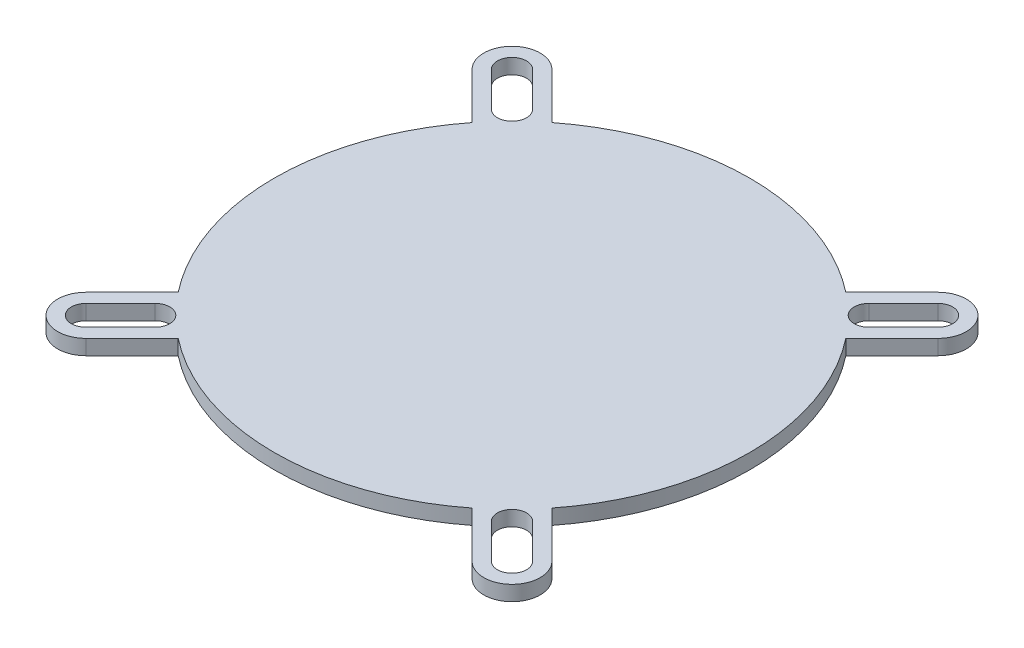
ISO-10303-21;
HEADER;
FILE_DESCRIPTION(('STEP AP214'),'2;1');
FILE_NAME('part.step','',(''),(''),'','','');
FILE_SCHEMA(('AUTOMOTIVE_DESIGN { 1 0 10303 214 1 1 1 1 }'));
ENDSEC;
DATA;
#1=APPLICATION_CONTEXT('core data for automotive mechanical design processes');
#2=APPLICATION_PROTOCOL_DEFINITION('international standard','automotive_design',2000,#1);
#3=PRODUCT_CONTEXT('',#1,'mechanical');
#4=PRODUCT('Part','Part','',(#3));
#5=PRODUCT_RELATED_PRODUCT_CATEGORY('part','',(#4));
#6=PRODUCT_DEFINITION_FORMATION('','',#4);
#7=PRODUCT_DEFINITION_CONTEXT('part definition',#1,'design');
#8=PRODUCT_DEFINITION('design','',#6,#7);
#9=PRODUCT_DEFINITION_SHAPE('','',#8);
#10=(LENGTH_UNIT() NAMED_UNIT(*) SI_UNIT(.MILLI.,.METRE.));
#11=(NAMED_UNIT(*) PLANE_ANGLE_UNIT() SI_UNIT($,.RADIAN.));
#12=(NAMED_UNIT(*) SI_UNIT($,.STERADIAN.) SOLID_ANGLE_UNIT());
#13=UNCERTAINTY_MEASURE_WITH_UNIT(LENGTH_MEASURE(1.E-05),#10,'distance_accuracy_value','');
#14=(GEOMETRIC_REPRESENTATION_CONTEXT(3) GLOBAL_UNCERTAINTY_ASSIGNED_CONTEXT((#13)) GLOBAL_UNIT_ASSIGNED_CONTEXT((#10,
#11,#12)) REPRESENTATION_CONTEXT('',''));
#15=CARTESIAN_POINT('',(0.,0.,0.));
#16=DIRECTION('',(0.,0.,1.));
#17=DIRECTION('',(1.,0.,0.));
#18=AXIS2_PLACEMENT_3D('',#15,#16,#17);
#19=CARTESIAN_POINT('',(0.,1.6,0.));
#20=DIRECTION('',(0.,-1.,0.));
#21=DIRECTION('',(0.,0.,-1.));
#22=AXIS2_PLACEMENT_3D('',#19,#20,#21);
#23=CYLINDRICAL_SURFACE('',#22,25.25);
#24=CARTESIAN_POINT('',(0.,0.,0.));
#25=DIRECTION('',(0.,1.,0.));
#26=DIRECTION('',(0.,0.,1.));
#27=AXIS2_PLACEMENT_3D('',#24,#25,#26);
#28=CIRCLE('',#27,25.25);
#29=CARTESIAN_POINT('',(-19.8492996418328,0.,-15.6066589547134));
#30=VERTEX_POINT('',#29);
#31=CARTESIAN_POINT('',(-19.8492996418328,0.,15.6066589547135));
#32=VERTEX_POINT('',#31);
#33=EDGE_CURVE('E491',#30,#32,#28,.T.);
#34=ORIENTED_EDGE('',*,*,#33,.T.);
#35=DIRECTION('',(0.,-1.,0.));
#36=VECTOR('',#35,1.);
#37=CARTESIAN_POINT('',(-19.8492996418328,1.6,15.6066589547135));
#38=LINE('',#37,#36);
#39=CARTESIAN_POINT('',(-19.8492996418328,1.6,15.6066589547135));
#40=VERTEX_POINT('',#39);
#41=EDGE_CURVE('E463',#32,#40,#38,.F.);
#42=ORIENTED_EDGE('',*,*,#41,.T.);
#43=CARTESIAN_POINT('',(0.,1.6,0.));
#44=DIRECTION('',(0.,1.,0.));
#45=DIRECTION('',(0.,0.,1.));
#46=AXIS2_PLACEMENT_3D('',#43,#44,#45);
#47=CIRCLE('',#46,25.25);
#48=CARTESIAN_POINT('',(-19.8492996418328,1.6,-15.6066589547134));
#49=VERTEX_POINT('',#48);
#50=EDGE_CURVE('E483',#49,#40,#47,.T.);
#51=ORIENTED_EDGE('',*,*,#50,.F.);
#52=DIRECTION('',(0.,-1.,0.));
#53=VECTOR('',#52,1.);
#54=CARTESIAN_POINT('',(-19.8492996418328,1.6,-15.6066589547134));
#55=LINE('',#54,#53);
#56=EDGE_CURVE('E444',#49,#30,#55,.T.);
#57=ORIENTED_EDGE('',*,*,#56,.T.);
#58=EDGE_LOOP('',(#34,#42,#51,#57));
#59=FACE_BOUND('',#58,.T.);
#60=ADVANCED_FACE('F35',(#59),#23,.T.);
#61=CARTESIAN_POINT('',(15.6066589547135,0.,-19.8492996418328));
#62=VERTEX_POINT('',#61);
#63=CARTESIAN_POINT('',(-15.6066589547135,0.,-19.8492996418327));
#64=VERTEX_POINT('',#63);
#65=EDGE_CURVE('E487',#62,#64,#28,.T.);
#66=ORIENTED_EDGE('',*,*,#65,.T.);
#67=DIRECTION('',(0.,-1.,0.));
#68=VECTOR('',#67,1.);
#69=CARTESIAN_POINT('',(-15.6066589547135,1.6,-19.8492996418327));
#70=LINE('',#69,#68);
#71=CARTESIAN_POINT('',(-15.6066589547135,1.6,-19.8492996418327));
#72=VERTEX_POINT('',#71);
#73=EDGE_CURVE('E481',#64,#72,#70,.F.);
#74=ORIENTED_EDGE('',*,*,#73,.T.);
#75=CARTESIAN_POINT('',(15.6066589547135,1.6,-19.8492996418328));
#76=VERTEX_POINT('',#75);
#77=EDGE_CURVE('E44',#76,#72,#47,.T.);
#78=ORIENTED_EDGE('',*,*,#77,.F.);
#79=DIRECTION('',(0.,-1.,0.));
#80=VECTOR('',#79,1.);
#81=CARTESIAN_POINT('',(15.6066589547135,1.6,-19.8492996418328));
#82=LINE('',#81,#80);
#83=EDGE_CURVE('E478',#76,#62,#82,.T.);
#84=ORIENTED_EDGE('',*,*,#83,.T.);
#85=EDGE_LOOP('',(#66,#74,#78,#84));
#86=FACE_BOUND('',#85,.T.);
#87=ADVANCED_FACE('F527',(#86),#23,.T.);
#88=CARTESIAN_POINT('',(19.8492996418327,0.,15.6066589547135));
#89=VERTEX_POINT('',#88);
#90=CARTESIAN_POINT('',(19.8492996418327,0.,-15.6066589547135));
#91=VERTEX_POINT('',#90);
#92=EDGE_CURVE('E484',#89,#91,#28,.T.);
#93=ORIENTED_EDGE('',*,*,#92,.T.);
#94=DIRECTION('',(0.,-1.,0.));
#95=VECTOR('',#94,1.);
#96=CARTESIAN_POINT('',(19.8492996418327,1.6,-15.6066589547135));
#97=LINE('',#96,#95);
#98=CARTESIAN_POINT('',(19.8492996418327,1.6,-15.6066589547135));
#99=VERTEX_POINT('',#98);
#100=EDGE_CURVE('E475',#91,#99,#97,.F.);
#101=ORIENTED_EDGE('',*,*,#100,.T.);
#102=CARTESIAN_POINT('',(19.8492996418327,1.6,15.6066589547135));
#103=VERTEX_POINT('',#102);
#104=EDGE_CURVE('E11',#103,#99,#47,.T.);
#105=ORIENTED_EDGE('',*,*,#104,.F.);
#106=DIRECTION('',(0.,-1.,0.));
#107=VECTOR('',#106,1.);
#108=CARTESIAN_POINT('',(19.8492996418327,1.6,15.6066589547135));
#109=LINE('',#108,#107);
#110=EDGE_CURVE('E472',#103,#89,#109,.T.);
#111=ORIENTED_EDGE('',*,*,#110,.T.);
#112=EDGE_LOOP('',(#93,#101,#105,#111));
#113=FACE_BOUND('',#112,.T.);
#114=ADVANCED_FACE('F523',(#113),#23,.T.);
#115=CARTESIAN_POINT('',(-15.6066589547135,0.,19.8492996418328));
#116=VERTEX_POINT('',#115);
#117=CARTESIAN_POINT('',(15.6066589547134,0.,19.8492996418328));
#118=VERTEX_POINT('',#117);
#119=EDGE_CURVE('E39',#116,#118,#28,.T.);
#120=ORIENTED_EDGE('',*,*,#119,.T.);
#121=DIRECTION('',(0.,-1.,0.));
#122=VECTOR('',#121,1.);
#123=CARTESIAN_POINT('',(15.6066589547134,1.6,19.8492996418328));
#124=LINE('',#123,#122);
#125=CARTESIAN_POINT('',(15.6066589547134,1.6,19.8492996418328));
#126=VERTEX_POINT('',#125);
#127=EDGE_CURVE('E469',#118,#126,#124,.F.);
#128=ORIENTED_EDGE('',*,*,#127,.T.);
#129=CARTESIAN_POINT('',(-15.6066589547135,1.6,19.8492996418328));
#130=VERTEX_POINT('',#129);
#131=EDGE_CURVE('E45',#130,#126,#47,.T.);
#132=ORIENTED_EDGE('',*,*,#131,.F.);
#133=DIRECTION('',(0.,-1.,0.));
#134=VECTOR('',#133,1.);
#135=CARTESIAN_POINT('',(-15.6066589547135,1.6,19.8492996418328));
#136=LINE('',#135,#134);
#137=EDGE_CURVE('E466',#130,#116,#136,.T.);
#138=ORIENTED_EDGE('',*,*,#137,.T.);
#139=EDGE_LOOP('',(#120,#128,#132,#138));
#140=FACE_BOUND('',#139,.T.);
#141=ADVANCED_FACE('F37',(#140),#23,.T.);
#142=CARTESIAN_POINT('',(0.,1.6,0.));
#143=DIRECTION('',(0.,1.,0.));
#144=DIRECTION('',(0.,0.,1.));
#145=AXIS2_PLACEMENT_3D('',#142,#143,#144);
#146=PLANE('',#145);
#147=CARTESIAN_POINT('',(18.9504617358008,1.6,18.9504617357982));
#148=DIRECTION('',(0.,1.,0.));
#149=DIRECTION('',(0.,0.,1.));
#150=AXIS2_PLACEMENT_3D('',#147,#148,#149);
#151=CIRCLE('',#150,1.55);
#152=CARTESIAN_POINT('',(20.0464772466399,1.6,17.854446224959));
#153=VERTEX_POINT('',#152);
#154=CARTESIAN_POINT('',(17.8544462249616,1.6,20.0464772466373));
#155=VERTEX_POINT('',#154);
#156=EDGE_CURVE('E310',#153,#155,#151,.T.);
#157=ORIENTED_EDGE('',*,*,#156,.F.);
#158=DIRECTION('',(-0.707106781186548,0.,-0.707106781186547));
#159=VECTOR('',#158,1.);
#160=CARTESIAN_POINT('',(23.72343250881,1.6,21.5314014871291));
#161=LINE('',#160,#159);
#162=CARTESIAN_POINT('',(23.72343250881,1.6,21.5314014871291));
#163=VERTEX_POINT('',#162);
#164=EDGE_CURVE('E307',#163,#153,#161,.T.);
#165=ORIENTED_EDGE('',*,*,#164,.F.);
#166=CARTESIAN_POINT('',(22.6274169979708,1.6,22.6274169979682));
#167=DIRECTION('',(0.,1.,0.));
#168=DIRECTION('',(0.,0.,1.));
#169=AXIS2_PLACEMENT_3D('',#166,#167,#168);
#170=CIRCLE('',#169,1.55);
#171=CARTESIAN_POINT('',(21.5314014871317,1.6,23.7234325088074));
#172=VERTEX_POINT('',#171);
#173=EDGE_CURVE('E288',#172,#163,#170,.T.);
#174=ORIENTED_EDGE('',*,*,#173,.F.);
#175=DIRECTION('',(0.707106781186547,0.,0.707106781186548));
#176=VECTOR('',#175,1.);
#177=CARTESIAN_POINT('',(21.5314014871317,1.6,23.7234325088074));
#178=LINE('',#177,#176);
#179=EDGE_CURVE('E297',#155,#172,#178,.T.);
#180=ORIENTED_EDGE('',*,*,#179,.F.);
#181=EDGE_LOOP('',(#157,#165,#174,#180));
#182=FACE_BOUND('',#181,.T.);
#183=CARTESIAN_POINT('',(18.9504617357994,1.6,-18.9504617358008));
#184=DIRECTION('',(0.,1.,0.));
#185=DIRECTION('',(0.,0.,1.));
#186=AXIS2_PLACEMENT_3D('',#183,#184,#185);
#187=CIRCLE('',#186,1.55);
#188=CARTESIAN_POINT('',(17.8544462249603,1.6,-20.0464772466399));
#189=VERTEX_POINT('',#188);
#190=CARTESIAN_POINT('',(20.0464772466386,1.6,-17.8544462249616));
#191=VERTEX_POINT('',#190);
#192=EDGE_CURVE('E342',#189,#191,#187,.T.);
#193=ORIENTED_EDGE('',*,*,#192,.F.);
#194=DIRECTION('',(-0.707106781186547,0.,0.707106781186547));
#195=VECTOR('',#194,1.);
#196=CARTESIAN_POINT('',(21.5314014871303,1.6,-23.72343250881));
#197=LINE('',#196,#195);
#198=CARTESIAN_POINT('',(21.5314014871303,1.6,-23.72343250881));
#199=VERTEX_POINT('',#198);
#200=EDGE_CURVE('E339',#199,#189,#197,.T.);
#201=ORIENTED_EDGE('',*,*,#200,.F.);
#202=CARTESIAN_POINT('',(22.6274169979695,1.6,-22.6274169979708));
#203=DIRECTION('',(0.,1.,0.));
#204=DIRECTION('',(0.,0.,1.));
#205=AXIS2_PLACEMENT_3D('',#202,#203,#204);
#206=CIRCLE('',#205,1.55);
#207=CARTESIAN_POINT('',(23.7234325088086,1.6,-21.5314014871317));
#208=VERTEX_POINT('',#207);
#209=EDGE_CURVE('E316',#208,#199,#206,.T.);
#210=ORIENTED_EDGE('',*,*,#209,.F.);
#211=DIRECTION('',(0.707106781186547,0.,-0.707106781186548));
#212=VECTOR('',#211,1.);
#213=CARTESIAN_POINT('',(23.7234325088086,1.6,-21.5314014871317));
#214=LINE('',#213,#212);
#215=EDGE_CURVE('E329',#191,#208,#214,.T.);
#216=ORIENTED_EDGE('',*,*,#215,.F.);
#217=EDGE_LOOP('',(#193,#201,#210,#216));
#218=FACE_BOUND('',#217,.T.);
#219=CARTESIAN_POINT('',(-18.9504617357995,1.6,-18.9504617357994));
#220=DIRECTION('',(0.,1.,0.));
#221=DIRECTION('',(0.,0.,1.));
#222=AXIS2_PLACEMENT_3D('',#219,#220,#221);
#223=CIRCLE('',#222,1.55);
#224=CARTESIAN_POINT('',(-20.0464772466387,1.6,-17.8544462249603));
#225=VERTEX_POINT('',#224);
#226=CARTESIAN_POINT('',(-17.8544462249604,1.6,-20.0464772466386));
#227=VERTEX_POINT('',#226);
#228=EDGE_CURVE('E374',#225,#227,#223,.T.);
#229=ORIENTED_EDGE('',*,*,#228,.F.);
#230=DIRECTION('',(0.707106781186547,0.,0.707106781186547));
#231=VECTOR('',#230,1.);
#232=CARTESIAN_POINT('',(-23.7234325088087,1.6,-21.5314014871303));
#233=LINE('',#232,#231);
#234=CARTESIAN_POINT('',(-23.7234325088087,1.6,-21.5314014871303));
#235=VERTEX_POINT('',#234);
#236=EDGE_CURVE('E371',#235,#225,#233,.T.);
#237=ORIENTED_EDGE('',*,*,#236,.F.);
#238=CARTESIAN_POINT('',(-22.6274169979696,1.6,-22.6274169979695));
#239=DIRECTION('',(0.,1.,0.));
#240=DIRECTION('',(0.,0.,1.));
#241=AXIS2_PLACEMENT_3D('',#238,#239,#240);
#242=CIRCLE('',#241,1.55);
#243=CARTESIAN_POINT('',(-21.5314014871304,1.6,-23.7234325088086));
#244=VERTEX_POINT('',#243);
#245=EDGE_CURVE('E348',#244,#235,#242,.T.);
#246=ORIENTED_EDGE('',*,*,#245,.F.);
#247=DIRECTION('',(-0.707106781186547,0.,-0.707106781186547));
#248=VECTOR('',#247,1.);
#249=CARTESIAN_POINT('',(-21.5314014871304,1.6,-23.7234325088086));
#250=LINE('',#249,#248);
#251=EDGE_CURVE('E361',#227,#244,#250,.T.);
#252=ORIENTED_EDGE('',*,*,#251,.F.);
#253=EDGE_LOOP('',(#229,#237,#246,#252));
#254=FACE_BOUND('',#253,.T.);
#255=CARTESIAN_POINT('',(-18.9504617357982,1.6,18.9504617357995));
#256=DIRECTION('',(0.,1.,0.));
#257=DIRECTION('',(0.,0.,1.));
#258=AXIS2_PLACEMENT_3D('',#255,#256,#257);
#259=CIRCLE('',#258,1.55);
#260=CARTESIAN_POINT('',(-17.854446224959,1.6,20.0464772466387));
#261=VERTEX_POINT('',#260);
#262=CARTESIAN_POINT('',(-20.0464772466373,1.6,17.8544462249604));
#263=VERTEX_POINT('',#262);
#264=EDGE_CURVE('E277',#261,#263,#259,.T.);
#265=ORIENTED_EDGE('',*,*,#264,.F.);
#266=DIRECTION('',(0.707106781186547,0.,-0.707106781186548));
#267=VECTOR('',#266,1.);
#268=CARTESIAN_POINT('',(-21.5314014871291,1.6,23.7234325088087));
#269=LINE('',#268,#267);
#270=CARTESIAN_POINT('',(-21.5314014871291,1.6,23.7234325088087));
#271=VERTEX_POINT('',#270);
#272=EDGE_CURVE('E283',#271,#261,#269,.T.);
#273=ORIENTED_EDGE('',*,*,#272,.F.);
#274=CARTESIAN_POINT('',(-22.6274169979682,1.6,22.6274169979696));
#275=DIRECTION('',(0.,1.,0.));
#276=DIRECTION('',(0.,0.,1.));
#277=AXIS2_PLACEMENT_3D('',#274,#275,#276);
#278=CIRCLE('',#277,1.55);
#279=CARTESIAN_POINT('',(-23.7234325088074,1.6,21.5314014871304));
#280=VERTEX_POINT('',#279);
#281=EDGE_CURVE('E256',#280,#271,#278,.T.);
#282=ORIENTED_EDGE('',*,*,#281,.F.);
#283=DIRECTION('',(-0.707106781186547,0.,0.707106781186548));
#284=VECTOR('',#283,1.);
#285=CARTESIAN_POINT('',(-23.7234325088074,1.6,21.5314014871304));
#286=LINE('',#285,#284);
#287=EDGE_CURVE('E274',#263,#280,#286,.T.);
#288=ORIENTED_EDGE('',*,*,#287,.F.);
#289=EDGE_LOOP('',(#265,#273,#282,#288));
#290=FACE_BOUND('',#289,.T.);
#291=ORIENTED_EDGE('',*,*,#77,.T.);
#292=DIRECTION('',(-0.707106781186548,0.,-0.707106781186547));
#293=VECTOR('',#292,1.);
#294=CARTESIAN_POINT('',(-20.5060966544099,1.6,-24.7487373415291));
#295=LINE('',#294,#293);
#296=CARTESIAN_POINT('',(-20.5060966544099,1.6,-24.7487373415291));
#297=VERTEX_POINT('',#296);
#298=EDGE_CURVE('E393',#72,#297,#295,.T.);
#299=ORIENTED_EDGE('',*,*,#298,.T.);
#300=CARTESIAN_POINT('',(-22.6274169979696,1.6,-22.6274169979695));
#301=DIRECTION('',(0.,1.,0.));
#302=DIRECTION('',(0.,0.,1.));
#303=AXIS2_PLACEMENT_3D('',#300,#301,#302);
#304=CIRCLE('',#303,3.);
#305=CARTESIAN_POINT('',(-24.7487373415292,1.6,-20.5060966544098));
#306=VERTEX_POINT('',#305);
#307=EDGE_CURVE('E380',#297,#306,#304,.T.);
#308=ORIENTED_EDGE('',*,*,#307,.T.);
#309=DIRECTION('',(0.707106781186548,0.,0.707106781186547));
#310=VECTOR('',#309,1.);
#311=CARTESIAN_POINT('',(-24.7487373415292,1.6,-20.5060966544098));
#312=LINE('',#311,#310);
#313=EDGE_CURVE('E59',#306,#49,#312,.T.);
#314=ORIENTED_EDGE('',*,*,#313,.T.);
#315=ORIENTED_EDGE('',*,*,#50,.T.);
#316=DIRECTION('',(-0.707106781186547,0.,0.707106781186548));
#317=VECTOR('',#316,1.);
#318=CARTESIAN_POINT('',(-24.7487373415292,1.6,20.5060966544099));
#319=LINE('',#318,#317);
#320=CARTESIAN_POINT('',(-24.7487373415292,1.6,20.5060966544099));
#321=VERTEX_POINT('',#320);
#322=EDGE_CURVE('E421',#40,#321,#319,.T.);
#323=ORIENTED_EDGE('',*,*,#322,.T.);
#324=CARTESIAN_POINT('',(-22.6274169979695,1.6,22.6274169979695));
#325=DIRECTION('',(0.,1.,0.));
#326=DIRECTION('',(0.,0.,1.));
#327=AXIS2_PLACEMENT_3D('',#324,#325,#326);
#328=CIRCLE('',#327,3.);
#329=CARTESIAN_POINT('',(-20.5060966544099,1.6,24.7487373415292));
#330=VERTEX_POINT('',#329);
#331=EDGE_CURVE('E423',#321,#330,#328,.T.);
#332=ORIENTED_EDGE('',*,*,#331,.T.);
#333=DIRECTION('',(0.707106781186547,0.,-0.707106781186548));
#334=VECTOR('',#333,1.);
#335=CARTESIAN_POINT('',(-20.5060966544099,1.6,24.7487373415292));
#336=LINE('',#335,#334);
#337=EDGE_CURVE('E52',#330,#130,#336,.T.);
#338=ORIENTED_EDGE('',*,*,#337,.T.);
#339=ORIENTED_EDGE('',*,*,#131,.T.);
#340=DIRECTION('',(0.707106781186547,0.,0.707106781186548));
#341=VECTOR('',#340,1.);
#342=CARTESIAN_POINT('',(0.,1.6,4.24264068711931));
#343=LINE('',#342,#341);
#344=CARTESIAN_POINT('',(20.5060966544098,1.6,24.7487373415292));
#345=VERTEX_POINT('',#344);
#346=EDGE_CURVE('E426',#126,#345,#343,.T.);
#347=ORIENTED_EDGE('',*,*,#346,.T.);
#348=CARTESIAN_POINT('',(22.6274169979695,1.6,22.6274169979696));
#349=DIRECTION('',(0.,1.,0.));
#350=DIRECTION('',(0.,0.,1.));
#351=AXIS2_PLACEMENT_3D('',#348,#349,#350);
#352=CIRCLE('',#351,3.);
#353=CARTESIAN_POINT('',(24.7487373415291,1.6,20.5060966544099));
#354=VERTEX_POINT('',#353);
#355=EDGE_CURVE('E428',#345,#354,#352,.T.);
#356=ORIENTED_EDGE('',*,*,#355,.T.);
#357=DIRECTION('',(-0.707106781186548,0.,-0.707106781186547));
#358=VECTOR('',#357,1.);
#359=CARTESIAN_POINT('',(4.24264068711924,1.6,0.));
#360=LINE('',#359,#358);
#361=EDGE_CURVE('E431',#354,#103,#360,.T.);
#362=ORIENTED_EDGE('',*,*,#361,.T.);
#363=ORIENTED_EDGE('',*,*,#104,.T.);
#364=DIRECTION('',(0.707106781186547,0.,-0.707106781186548));
#365=VECTOR('',#364,1.);
#366=CARTESIAN_POINT('',(4.24264068711924,1.6,0.));
#367=LINE('',#366,#365);
#368=CARTESIAN_POINT('',(24.7487373415292,1.6,-20.5060966544099));
#369=VERTEX_POINT('',#368);
#370=EDGE_CURVE('E433',#99,#369,#367,.T.);
#371=ORIENTED_EDGE('',*,*,#370,.T.);
#372=CARTESIAN_POINT('',(22.6274169979695,1.6,-22.6274169979695));
#373=DIRECTION('',(0.,1.,0.));
#374=DIRECTION('',(0.,0.,1.));
#375=AXIS2_PLACEMENT_3D('',#372,#373,#374);
#376=CIRCLE('',#375,3.);
#377=CARTESIAN_POINT('',(20.5060966544099,1.6,-24.7487373415292));
#378=VERTEX_POINT('',#377);
#379=EDGE_CURVE('E435',#369,#378,#376,.T.);
#380=ORIENTED_EDGE('',*,*,#379,.T.);
#381=DIRECTION('',(-0.707106781186547,0.,0.707106781186548));
#382=VECTOR('',#381,1.);
#383=CARTESIAN_POINT('',(0.,1.6,-4.24264068711925));
#384=LINE('',#383,#382);
#385=EDGE_CURVE('E438',#378,#76,#384,.T.);
#386=ORIENTED_EDGE('',*,*,#385,.T.);
#387=EDGE_LOOP('',(#291,#299,#308,#314,#315,#323,#332,#338,#339,#347,#356,#362,#363,#371,#380,#386));
#388=FACE_BOUND('',#387,.T.);
#389=ADVANCED_FACE('F512',(#182,#218,#254,#290,#388),#146,.T.);
#390=CARTESIAN_POINT('',(0.,0.,0.));
#391=DIRECTION('',(0.,1.,0.));
#392=DIRECTION('',(0.,0.,1.));
#393=AXIS2_PLACEMENT_3D('',#390,#391,#392);
#394=PLANE('',#393);
#395=DIRECTION('',(-0.707106781186548,0.,-0.707106781186547));
#396=VECTOR('',#395,1.);
#397=CARTESIAN_POINT('',(23.72343250881,0.,21.5314014871291));
#398=LINE('',#397,#396);
#399=CARTESIAN_POINT('',(23.72343250881,0.,21.5314014871291));
#400=VERTEX_POINT('',#399);
#401=CARTESIAN_POINT('',(20.0464772466399,0.,17.854446224959));
#402=VERTEX_POINT('',#401);
#403=EDGE_CURVE('E296',#400,#402,#398,.T.);
#404=ORIENTED_EDGE('',*,*,#403,.T.);
#405=CARTESIAN_POINT('',(18.9504617358008,0.,18.9504617357982));
#406=DIRECTION('',(0.,1.,0.));
#407=DIRECTION('',(0.,0.,1.));
#408=AXIS2_PLACEMENT_3D('',#405,#406,#407);
#409=CIRCLE('',#408,1.55);
#410=CARTESIAN_POINT('',(17.8544462249616,0.,20.0464772466373));
#411=VERTEX_POINT('',#410);
#412=EDGE_CURVE('E300',#402,#411,#409,.T.);
#413=ORIENTED_EDGE('',*,*,#412,.T.);
#414=DIRECTION('',(0.707106781186547,0.,0.707106781186548));
#415=VECTOR('',#414,1.);
#416=CARTESIAN_POINT('',(21.5314014871317,0.,23.7234325088074));
#417=LINE('',#416,#415);
#418=CARTESIAN_POINT('',(21.5314014871317,0.,23.7234325088074));
#419=VERTEX_POINT('',#418);
#420=EDGE_CURVE('E302',#411,#419,#417,.T.);
#421=ORIENTED_EDGE('',*,*,#420,.T.);
#422=CARTESIAN_POINT('',(22.6274169979708,0.,22.6274169979682));
#423=DIRECTION('',(0.,1.,0.));
#424=DIRECTION('',(0.,0.,1.));
#425=AXIS2_PLACEMENT_3D('',#422,#423,#424);
#426=CIRCLE('',#425,1.55);
#427=EDGE_CURVE('E293',#419,#400,#426,.T.);
#428=ORIENTED_EDGE('',*,*,#427,.T.);
#429=EDGE_LOOP('',(#404,#413,#421,#428));
#430=FACE_BOUND('',#429,.T.);
#431=DIRECTION('',(-0.707106781186547,0.,0.707106781186547));
#432=VECTOR('',#431,1.);
#433=CARTESIAN_POINT('',(21.5314014871303,0.,-23.72343250881));
#434=LINE('',#433,#432);
#435=CARTESIAN_POINT('',(21.5314014871303,0.,-23.72343250881));
#436=VERTEX_POINT('',#435);
#437=CARTESIAN_POINT('',(17.8544462249603,0.,-20.0464772466399));
#438=VERTEX_POINT('',#437);
#439=EDGE_CURVE('E328',#436,#438,#434,.T.);
#440=ORIENTED_EDGE('',*,*,#439,.T.);
#441=CARTESIAN_POINT('',(18.9504617357994,0.,-18.9504617358008));
#442=DIRECTION('',(0.,1.,0.));
#443=DIRECTION('',(0.,0.,1.));
#444=AXIS2_PLACEMENT_3D('',#441,#442,#443);
#445=CIRCLE('',#444,1.55);
#446=CARTESIAN_POINT('',(20.0464772466386,0.,-17.8544462249616));
#447=VERTEX_POINT('',#446);
#448=EDGE_CURVE('E332',#438,#447,#445,.T.);
#449=ORIENTED_EDGE('',*,*,#448,.T.);
#450=DIRECTION('',(0.707106781186547,0.,-0.707106781186548));
#451=VECTOR('',#450,1.);
#452=CARTESIAN_POINT('',(23.7234325088086,0.,-21.5314014871317));
#453=LINE('',#452,#451);
#454=CARTESIAN_POINT('',(23.7234325088086,0.,-21.5314014871317));
#455=VERTEX_POINT('',#454);
#456=EDGE_CURVE('E334',#447,#455,#453,.T.);
#457=ORIENTED_EDGE('',*,*,#456,.T.);
#458=CARTESIAN_POINT('',(22.6274169979695,0.,-22.6274169979708));
#459=DIRECTION('',(0.,1.,0.));
#460=DIRECTION('',(0.,0.,1.));
#461=AXIS2_PLACEMENT_3D('',#458,#459,#460);
#462=CIRCLE('',#461,1.55);
#463=EDGE_CURVE('E325',#455,#436,#462,.T.);
#464=ORIENTED_EDGE('',*,*,#463,.T.);
#465=EDGE_LOOP('',(#440,#449,#457,#464));
#466=FACE_BOUND('',#465,.T.);
#467=DIRECTION('',(0.707106781186547,0.,0.707106781186547));
#468=VECTOR('',#467,1.);
#469=CARTESIAN_POINT('',(-23.7234325088087,0.,-21.5314014871303));
#470=LINE('',#469,#468);
#471=CARTESIAN_POINT('',(-23.7234325088087,0.,-21.5314014871303));
#472=VERTEX_POINT('',#471);
#473=CARTESIAN_POINT('',(-20.0464772466387,0.,-17.8544462249603));
#474=VERTEX_POINT('',#473);
#475=EDGE_CURVE('E360',#472,#474,#470,.T.);
#476=ORIENTED_EDGE('',*,*,#475,.T.);
#477=CARTESIAN_POINT('',(-18.9504617357995,0.,-18.9504617357994));
#478=DIRECTION('',(0.,1.,0.));
#479=DIRECTION('',(0.,0.,1.));
#480=AXIS2_PLACEMENT_3D('',#477,#478,#479);
#481=CIRCLE('',#480,1.55);
#482=CARTESIAN_POINT('',(-17.8544462249604,0.,-20.0464772466386));
#483=VERTEX_POINT('',#482);
#484=EDGE_CURVE('E364',#474,#483,#481,.T.);
#485=ORIENTED_EDGE('',*,*,#484,.T.);
#486=DIRECTION('',(-0.707106781186547,0.,-0.707106781186547));
#487=VECTOR('',#486,1.);
#488=CARTESIAN_POINT('',(-21.5314014871304,0.,-23.7234325088086));
#489=LINE('',#488,#487);
#490=CARTESIAN_POINT('',(-21.5314014871304,0.,-23.7234325088086));
#491=VERTEX_POINT('',#490);
#492=EDGE_CURVE('E366',#483,#491,#489,.T.);
#493=ORIENTED_EDGE('',*,*,#492,.T.);
#494=CARTESIAN_POINT('',(-22.6274169979696,0.,-22.6274169979695));
#495=DIRECTION('',(0.,1.,0.));
#496=DIRECTION('',(0.,0.,1.));
#497=AXIS2_PLACEMENT_3D('',#494,#495,#496);
#498=CIRCLE('',#497,1.55);
#499=EDGE_CURVE('E357',#491,#472,#498,.T.);
#500=ORIENTED_EDGE('',*,*,#499,.T.);
#501=EDGE_LOOP('',(#476,#485,#493,#500));
#502=FACE_BOUND('',#501,.T.);
#503=DIRECTION('',(0.707106781186547,0.,-0.707106781186548));
#504=VECTOR('',#503,1.);
#505=CARTESIAN_POINT('',(-21.5314014871291,0.,23.7234325088087));
#506=LINE('',#505,#504);
#507=CARTESIAN_POINT('',(-21.5314014871291,0.,23.7234325088087));
#508=VERTEX_POINT('',#507);
#509=CARTESIAN_POINT('',(-17.854446224959,0.,20.0464772466387));
#510=VERTEX_POINT('',#509);
#511=EDGE_CURVE('E265',#508,#510,#506,.T.);
#512=ORIENTED_EDGE('',*,*,#511,.T.);
#513=CARTESIAN_POINT('',(-18.9504617357982,0.,18.9504617357995));
#514=DIRECTION('',(0.,1.,0.));
#515=DIRECTION('',(0.,0.,1.));
#516=AXIS2_PLACEMENT_3D('',#513,#514,#515);
#517=CIRCLE('',#516,1.55);
#518=CARTESIAN_POINT('',(-20.0464772466373,0.,17.8544462249604));
#519=VERTEX_POINT('',#518);
#520=EDGE_CURVE('E269',#510,#519,#517,.T.);
#521=ORIENTED_EDGE('',*,*,#520,.T.);
#522=DIRECTION('',(-0.707106781186547,0.,0.707106781186548));
#523=VECTOR('',#522,1.);
#524=CARTESIAN_POINT('',(-23.7234325088074,0.,21.5314014871304));
#525=LINE('',#524,#523);
#526=CARTESIAN_POINT('',(-23.7234325088074,0.,21.5314014871304));
#527=VERTEX_POINT('',#526);
#528=EDGE_CURVE('E261',#519,#527,#525,.T.);
#529=ORIENTED_EDGE('',*,*,#528,.T.);
#530=CARTESIAN_POINT('',(-22.6274169979682,0.,22.6274169979696));
#531=DIRECTION('',(0.,1.,0.));
#532=DIRECTION('',(0.,0.,1.));
#533=AXIS2_PLACEMENT_3D('',#530,#531,#532);
#534=CIRCLE('',#533,1.55);
#535=EDGE_CURVE('E253',#527,#508,#534,.T.);
#536=ORIENTED_EDGE('',*,*,#535,.T.);
#537=EDGE_LOOP('',(#512,#521,#529,#536));
#538=FACE_BOUND('',#537,.T.);
#539=DIRECTION('',(-0.707106781186548,0.,-0.707106781186547));
#540=VECTOR('',#539,1.);
#541=CARTESIAN_POINT('',(-20.5060966544099,0.,-24.7487373415291));
#542=LINE('',#541,#540);
#543=CARTESIAN_POINT('',(-20.5060966544099,0.,-24.7487373415291));
#544=VERTEX_POINT('',#543);
#545=EDGE_CURVE('E416',#64,#544,#542,.T.);
#546=ORIENTED_EDGE('',*,*,#545,.F.);
#547=ORIENTED_EDGE('',*,*,#65,.F.);
#548=DIRECTION('',(-0.707106781186547,0.,0.707106781186548));
#549=VECTOR('',#548,1.);
#550=CARTESIAN_POINT('',(0.,0.,-4.24264068711925));
#551=LINE('',#550,#549);
#552=CARTESIAN_POINT('',(20.5060966544099,0.,-24.7487373415292));
#553=VERTEX_POINT('',#552);
#554=EDGE_CURVE('E414',#553,#62,#551,.T.);
#555=ORIENTED_EDGE('',*,*,#554,.F.);
#556=CARTESIAN_POINT('',(22.6274169979695,0.,-22.6274169979695));
#557=DIRECTION('',(0.,1.,0.));
#558=DIRECTION('',(0.,0.,1.));
#559=AXIS2_PLACEMENT_3D('',#556,#557,#558);
#560=CIRCLE('',#559,3.);
#561=CARTESIAN_POINT('',(24.7487373415292,0.,-20.5060966544099));
#562=VERTEX_POINT('',#561);
#563=EDGE_CURVE('E411',#562,#553,#560,.T.);
#564=ORIENTED_EDGE('',*,*,#563,.F.);
#565=DIRECTION('',(0.707106781186547,0.,-0.707106781186548));
#566=VECTOR('',#565,1.);
#567=CARTESIAN_POINT('',(4.24264068711924,0.,0.));
#568=LINE('',#567,#566);
#569=EDGE_CURVE('E409',#91,#562,#568,.T.);
#570=ORIENTED_EDGE('',*,*,#569,.F.);
#571=ORIENTED_EDGE('',*,*,#92,.F.);
#572=DIRECTION('',(-0.707106781186548,0.,-0.707106781186547));
#573=VECTOR('',#572,1.);
#574=CARTESIAN_POINT('',(4.24264068711924,0.,0.));
#575=LINE('',#574,#573);
#576=CARTESIAN_POINT('',(24.7487373415291,0.,20.5060966544099));
#577=VERTEX_POINT('',#576);
#578=EDGE_CURVE('E407',#577,#89,#575,.T.);
#579=ORIENTED_EDGE('',*,*,#578,.F.);
#580=CARTESIAN_POINT('',(22.6274169979695,0.,22.6274169979696));
#581=DIRECTION('',(0.,1.,0.));
#582=DIRECTION('',(0.,0.,1.));
#583=AXIS2_PLACEMENT_3D('',#580,#581,#582);
#584=CIRCLE('',#583,3.);
#585=CARTESIAN_POINT('',(20.5060966544098,0.,24.7487373415292));
#586=VERTEX_POINT('',#585);
#587=EDGE_CURVE('E404',#586,#577,#584,.T.);
#588=ORIENTED_EDGE('',*,*,#587,.F.);
#589=DIRECTION('',(0.707106781186547,0.,0.707106781186548));
#590=VECTOR('',#589,1.);
#591=CARTESIAN_POINT('',(0.,0.,4.24264068711931));
#592=LINE('',#591,#590);
#593=EDGE_CURVE('E402',#118,#586,#592,.T.);
#594=ORIENTED_EDGE('',*,*,#593,.F.);
#595=ORIENTED_EDGE('',*,*,#119,.F.);
#596=DIRECTION('',(0.707106781186547,0.,-0.707106781186548));
#597=VECTOR('',#596,1.);
#598=CARTESIAN_POINT('',(-20.5060966544099,0.,24.7487373415292));
#599=LINE('',#598,#597);
#600=CARTESIAN_POINT('',(-20.5060966544099,0.,24.7487373415292));
#601=VERTEX_POINT('',#600);
#602=EDGE_CURVE('E400',#601,#116,#599,.T.);
#603=ORIENTED_EDGE('',*,*,#602,.F.);
#604=CARTESIAN_POINT('',(-22.6274169979695,0.,22.6274169979695));
#605=DIRECTION('',(0.,1.,0.));
#606=DIRECTION('',(0.,0.,1.));
#607=AXIS2_PLACEMENT_3D('',#604,#605,#606);
#608=CIRCLE('',#607,3.);
#609=CARTESIAN_POINT('',(-24.7487373415292,0.,20.5060966544099));
#610=VERTEX_POINT('',#609);
#611=EDGE_CURVE('E397',#610,#601,#608,.T.);
#612=ORIENTED_EDGE('',*,*,#611,.F.);
#613=DIRECTION('',(-0.707106781186547,0.,0.707106781186548));
#614=VECTOR('',#613,1.);
#615=CARTESIAN_POINT('',(-24.7487373415292,0.,20.5060966544099));
#616=LINE('',#615,#614);
#617=EDGE_CURVE('E395',#32,#610,#616,.T.);
#618=ORIENTED_EDGE('',*,*,#617,.F.);
#619=ORIENTED_EDGE('',*,*,#33,.F.);
#620=DIRECTION('',(0.707106781186548,0.,0.707106781186547));
#621=VECTOR('',#620,1.);
#622=CARTESIAN_POINT('',(-24.7487373415292,0.,-20.5060966544098));
#623=LINE('',#622,#621);
#624=CARTESIAN_POINT('',(-24.7487373415292,0.,-20.5060966544098));
#625=VERTEX_POINT('',#624);
#626=EDGE_CURVE('E392',#625,#30,#623,.T.);
#627=ORIENTED_EDGE('',*,*,#626,.F.);
#628=CARTESIAN_POINT('',(-22.6274169979696,0.,-22.6274169979695));
#629=DIRECTION('',(0.,1.,0.));
#630=DIRECTION('',(0.,0.,1.));
#631=AXIS2_PLACEMENT_3D('',#628,#629,#630);
#632=CIRCLE('',#631,3.);
#633=EDGE_CURVE('E389',#544,#625,#632,.T.);
#634=ORIENTED_EDGE('',*,*,#633,.F.);
#635=EDGE_LOOP('',(#546,#547,#555,#564,#570,#571,#579,#588,#594,#595,#603,#612,#618,#619,#627,#634));
#636=FACE_BOUND('',#635,.T.);
#637=ADVANCED_FACE('F271',(#430,#466,#502,#538,#636),#394,.F.);
#638=CARTESIAN_POINT('',(-18.9504617357982,0.,18.9504617357995));
#639=DIRECTION('',(0.,1.,0.));
#640=DIRECTION('',(0.,0.,1.));
#641=AXIS2_PLACEMENT_3D('',#638,#639,#640);
#642=CYLINDRICAL_SURFACE('',#641,1.55);
#643=ORIENTED_EDGE('',*,*,#520,.F.);
#644=DIRECTION('',(0.,1.,0.));
#645=VECTOR('',#644,1.);
#646=CARTESIAN_POINT('',(-17.854446224959,0.,20.0464772466387));
#647=LINE('',#646,#645);
#648=EDGE_CURVE('E260',#510,#261,#647,.T.);
#649=ORIENTED_EDGE('',*,*,#648,.T.);
#650=ORIENTED_EDGE('',*,*,#264,.T.);
#651=DIRECTION('',(0.,1.,0.));
#652=VECTOR('',#651,1.);
#653=CARTESIAN_POINT('',(-20.0464772466373,0.,17.8544462249604));
#654=LINE('',#653,#652);
#655=EDGE_CURVE('E289',#519,#263,#654,.T.);
#656=ORIENTED_EDGE('',*,*,#655,.F.);
#657=EDGE_LOOP('',(#643,#649,#650,#656));
#658=FACE_BOUND('',#657,.T.);
#659=ADVANCED_FACE('F521',(#658),#642,.F.);
#660=CARTESIAN_POINT('',(-23.7234325088074,0.,21.5314014871304));
#661=DIRECTION('',(-0.707106781186548,0.,-0.707106781186547));
#662=DIRECTION('',(-0.707106781186547,0.,0.707106781186548));
#663=AXIS2_PLACEMENT_3D('',#660,#661,#662);
#664=PLANE('',#663);
#665=ORIENTED_EDGE('',*,*,#287,.T.);
#666=DIRECTION('',(0.,1.,0.));
#667=VECTOR('',#666,1.);
#668=CARTESIAN_POINT('',(-23.7234325088074,0.,21.5314014871304));
#669=LINE('',#668,#667);
#670=EDGE_CURVE('E286',#527,#280,#669,.T.);
#671=ORIENTED_EDGE('',*,*,#670,.F.);
#672=ORIENTED_EDGE('',*,*,#528,.F.);
#673=ORIENTED_EDGE('',*,*,#655,.T.);
#674=EDGE_LOOP('',(#665,#671,#672,#673));
#675=FACE_BOUND('',#674,.T.);
#676=ADVANCED_FACE('F637',(#675),#664,.F.);
#677=CARTESIAN_POINT('',(-22.6274169979682,0.,22.6274169979696));
#678=DIRECTION('',(0.,1.,0.));
#679=DIRECTION('',(0.,0.,1.));
#680=AXIS2_PLACEMENT_3D('',#677,#678,#679);
#681=CYLINDRICAL_SURFACE('',#680,1.55);
#682=ORIENTED_EDGE('',*,*,#281,.T.);
#683=DIRECTION('',(0.,1.,0.));
#684=VECTOR('',#683,1.);
#685=CARTESIAN_POINT('',(-21.5314014871291,0.,23.7234325088087));
#686=LINE('',#685,#684);
#687=EDGE_CURVE('E249',#508,#271,#686,.T.);
#688=ORIENTED_EDGE('',*,*,#687,.F.);
#689=ORIENTED_EDGE('',*,*,#535,.F.);
#690=ORIENTED_EDGE('',*,*,#670,.T.);
#691=EDGE_LOOP('',(#682,#688,#689,#690));
#692=FACE_BOUND('',#691,.T.);
#693=ADVANCED_FACE('F251',(#692),#681,.F.);
#694=CARTESIAN_POINT('',(-21.5314014871291,0.,23.7234325088087));
#695=DIRECTION('',(0.707106781186548,0.,0.707106781186547));
#696=DIRECTION('',(0.707106781186547,0.,-0.707106781186548));
#697=AXIS2_PLACEMENT_3D('',#694,#695,#696);
#698=PLANE('',#697);
#699=ORIENTED_EDGE('',*,*,#272,.T.);
#700=ORIENTED_EDGE('',*,*,#648,.F.);
#701=ORIENTED_EDGE('',*,*,#511,.F.);
#702=ORIENTED_EDGE('',*,*,#687,.T.);
#703=EDGE_LOOP('',(#699,#700,#701,#702));
#704=FACE_BOUND('',#703,.T.);
#705=ADVANCED_FACE('F266',(#704),#698,.F.);
#706=CARTESIAN_POINT('',(-22.6274169979695,0.,22.6274169979695));
#707=DIRECTION('',(0.,1.,0.));
#708=DIRECTION('',(0.,0.,1.));
#709=AXIS2_PLACEMENT_3D('',#706,#707,#708);
#710=CYLINDRICAL_SURFACE('',#709,3.);
#711=ORIENTED_EDGE('',*,*,#331,.F.);
#712=DIRECTION('',(0.,1.,0.));
#713=VECTOR('',#712,1.);
#714=CARTESIAN_POINT('',(-24.7487373415292,0.,20.5060966544099));
#715=LINE('',#714,#713);
#716=EDGE_CURVE('E457',#610,#321,#715,.T.);
#717=ORIENTED_EDGE('',*,*,#716,.F.);
#718=ORIENTED_EDGE('',*,*,#611,.T.);
#719=DIRECTION('',(0.,1.,0.));
#720=VECTOR('',#719,1.);
#721=CARTESIAN_POINT('',(-20.5060966544099,0.,24.7487373415292));
#722=LINE('',#721,#720);
#723=EDGE_CURVE('E455',#601,#330,#722,.T.);
#724=ORIENTED_EDGE('',*,*,#723,.T.);
#725=EDGE_LOOP('',(#711,#717,#718,#724));
#726=FACE_BOUND('',#725,.T.);
#727=ADVANCED_FACE('F510',(#726),#710,.T.);
#728=CARTESIAN_POINT('',(-24.7487373415292,0.,20.5060966544099));
#729=DIRECTION('',(-0.707106781186548,0.,-0.707106781186548));
#730=DIRECTION('',(-0.707106781186547,0.,0.707106781186548));
#731=AXIS2_PLACEMENT_3D('',#728,#729,#730);
#732=PLANE('',#731);
#733=ORIENTED_EDGE('',*,*,#41,.F.);
#734=ORIENTED_EDGE('',*,*,#617,.T.);
#735=ORIENTED_EDGE('',*,*,#716,.T.);
#736=ORIENTED_EDGE('',*,*,#322,.F.);
#737=EDGE_LOOP('',(#733,#734,#735,#736));
#738=FACE_BOUND('',#737,.T.);
#739=ADVANCED_FACE('F507',(#738),#732,.T.);
#740=CARTESIAN_POINT('',(-20.5060966544099,0.,24.7487373415292));
#741=DIRECTION('',(0.707106781186548,0.,0.707106781186547));
#742=DIRECTION('',(0.707106781186547,0.,-0.707106781186548));
#743=AXIS2_PLACEMENT_3D('',#740,#741,#742);
#744=PLANE('',#743);
#745=ORIENTED_EDGE('',*,*,#137,.F.);
#746=ORIENTED_EDGE('',*,*,#337,.F.);
#747=ORIENTED_EDGE('',*,*,#723,.F.);
#748=ORIENTED_EDGE('',*,*,#602,.T.);
#749=EDGE_LOOP('',(#745,#746,#747,#748));
#750=FACE_BOUND('',#749,.T.);
#751=ADVANCED_FACE('F559',(#750),#744,.T.);
#752=CARTESIAN_POINT('',(-18.9504617357995,0.,-18.9504617357994));
#753=DIRECTION('',(0.,1.,0.));
#754=DIRECTION('',(0.,0.,1.));
#755=AXIS2_PLACEMENT_3D('',#752,#753,#754);
#756=CYLINDRICAL_SURFACE('',#755,1.55);
#757=ORIENTED_EDGE('',*,*,#484,.F.);
#758=DIRECTION('',(0.,1.,0.));
#759=VECTOR('',#758,1.);
#760=CARTESIAN_POINT('',(-20.0464772466387,0.,-17.8544462249603));
#761=LINE('',#760,#759);
#762=EDGE_CURVE('E384',#474,#225,#761,.T.);
#763=ORIENTED_EDGE('',*,*,#762,.T.);
#764=ORIENTED_EDGE('',*,*,#228,.T.);
#765=DIRECTION('',(0.,1.,0.));
#766=VECTOR('',#765,1.);
#767=CARTESIAN_POINT('',(-17.8544462249604,0.,-20.0464772466386));
#768=LINE('',#767,#766);
#769=EDGE_CURVE('E381',#483,#227,#768,.T.);
#770=ORIENTED_EDGE('',*,*,#769,.F.);
#771=EDGE_LOOP('',(#757,#763,#764,#770));
#772=FACE_BOUND('',#771,.T.);
#773=ADVANCED_FACE('F564',(#772),#756,.F.);
#774=CARTESIAN_POINT('',(-21.5314014871304,0.,-23.7234325088086));
#775=DIRECTION('',(0.707106781186548,0.,-0.707106781186548));
#776=DIRECTION('',(-0.707106781186548,0.,-0.707106781186548));
#777=AXIS2_PLACEMENT_3D('',#774,#775,#776);
#778=PLANE('',#777);
#779=ORIENTED_EDGE('',*,*,#251,.T.);
#780=DIRECTION('',(0.,1.,0.));
#781=VECTOR('',#780,1.);
#782=CARTESIAN_POINT('',(-21.5314014871304,0.,-23.7234325088086));
#783=LINE('',#782,#781);
#784=EDGE_CURVE('E378',#491,#244,#783,.T.);
#785=ORIENTED_EDGE('',*,*,#784,.F.);
#786=ORIENTED_EDGE('',*,*,#492,.F.);
#787=ORIENTED_EDGE('',*,*,#769,.T.);
#788=EDGE_LOOP('',(#779,#785,#786,#787));
#789=FACE_BOUND('',#788,.T.);
#790=ADVANCED_FACE('F596',(#789),#778,.F.);
#791=CARTESIAN_POINT('',(-22.6274169979696,0.,-22.6274169979695));
#792=DIRECTION('',(0.,1.,0.));
#793=DIRECTION('',(0.,0.,1.));
#794=AXIS2_PLACEMENT_3D('',#791,#792,#793);
#795=CYLINDRICAL_SURFACE('',#794,1.55);
#796=ORIENTED_EDGE('',*,*,#245,.T.);
#797=DIRECTION('',(0.,1.,0.));
#798=VECTOR('',#797,1.);
#799=CARTESIAN_POINT('',(-23.7234325088087,0.,-21.5314014871303));
#800=LINE('',#799,#798);
#801=EDGE_CURVE('E369',#472,#235,#800,.T.);
#802=ORIENTED_EDGE('',*,*,#801,.F.);
#803=ORIENTED_EDGE('',*,*,#499,.F.);
#804=ORIENTED_EDGE('',*,*,#784,.T.);
#805=EDGE_LOOP('',(#796,#802,#803,#804));
#806=FACE_BOUND('',#805,.T.);
#807=ADVANCED_FACE('F593',(#806),#795,.F.);
#808=CARTESIAN_POINT('',(-23.7234325088087,0.,-21.5314014871303));
#809=DIRECTION('',(-0.707106781186548,0.,0.707106781186548));
#810=DIRECTION('',(0.707106781186548,0.,0.707106781186548));
#811=AXIS2_PLACEMENT_3D('',#808,#809,#810);
#812=PLANE('',#811);
#813=ORIENTED_EDGE('',*,*,#236,.T.);
#814=ORIENTED_EDGE('',*,*,#762,.F.);
#815=ORIENTED_EDGE('',*,*,#475,.F.);
#816=ORIENTED_EDGE('',*,*,#801,.T.);
#817=EDGE_LOOP('',(#813,#814,#815,#816));
#818=FACE_BOUND('',#817,.T.);
#819=ADVANCED_FACE('F555',(#818),#812,.F.);
#820=CARTESIAN_POINT('',(-22.6274169979696,0.,-22.6274169979695));
#821=DIRECTION('',(0.,1.,0.));
#822=DIRECTION('',(0.,0.,1.));
#823=AXIS2_PLACEMENT_3D('',#820,#821,#822);
#824=CYLINDRICAL_SURFACE('',#823,3.);
#825=ORIENTED_EDGE('',*,*,#307,.F.);
#826=DIRECTION('',(0.,1.,0.));
#827=VECTOR('',#826,1.);
#828=CARTESIAN_POINT('',(-20.5060966544099,0.,-24.7487373415291));
#829=LINE('',#828,#827);
#830=EDGE_CURVE('E441',#544,#297,#829,.T.);
#831=ORIENTED_EDGE('',*,*,#830,.F.);
#832=ORIENTED_EDGE('',*,*,#633,.T.);
#833=DIRECTION('',(0.,1.,0.));
#834=VECTOR('',#833,1.);
#835=CARTESIAN_POINT('',(-24.7487373415292,0.,-20.5060966544098));
#836=LINE('',#835,#834);
#837=EDGE_CURVE('E418',#625,#306,#836,.T.);
#838=ORIENTED_EDGE('',*,*,#837,.T.);
#839=EDGE_LOOP('',(#825,#831,#832,#838));
#840=FACE_BOUND('',#839,.T.);
#841=ADVANCED_FACE('F544',(#840),#824,.T.);
#842=CARTESIAN_POINT('',(-24.7487373415292,0.,-20.5060966544098));
#843=DIRECTION('',(-0.707106781186547,0.,0.707106781186548));
#844=DIRECTION('',(0.707106781186548,0.,0.707106781186547));
#845=AXIS2_PLACEMENT_3D('',#842,#843,#844);
#846=PLANE('',#845);
#847=ORIENTED_EDGE('',*,*,#56,.F.);
#848=ORIENTED_EDGE('',*,*,#313,.F.);
#849=ORIENTED_EDGE('',*,*,#837,.F.);
#850=ORIENTED_EDGE('',*,*,#626,.T.);
#851=EDGE_LOOP('',(#847,#848,#849,#850));
#852=FACE_BOUND('',#851,.T.);
#853=ADVANCED_FACE('F546',(#852),#846,.T.);
#854=CARTESIAN_POINT('',(-20.5060966544099,0.,-24.7487373415291));
#855=DIRECTION('',(0.707106781186548,0.,-0.707106781186548));
#856=DIRECTION('',(-0.707106781186548,0.,-0.707106781186548));
#857=AXIS2_PLACEMENT_3D('',#854,#855,#856);
#858=PLANE('',#857);
#859=ORIENTED_EDGE('',*,*,#73,.F.);
#860=ORIENTED_EDGE('',*,*,#545,.T.);
#861=ORIENTED_EDGE('',*,*,#830,.T.);
#862=ORIENTED_EDGE('',*,*,#298,.F.);
#863=EDGE_LOOP('',(#859,#860,#861,#862));
#864=FACE_BOUND('',#863,.T.);
#865=ADVANCED_FACE('F541',(#864),#858,.T.);
#866=CARTESIAN_POINT('',(18.9504617357994,0.,-18.9504617358008));
#867=DIRECTION('',(0.,1.,0.));
#868=DIRECTION('',(0.,0.,1.));
#869=AXIS2_PLACEMENT_3D('',#866,#867,#868);
#870=CYLINDRICAL_SURFACE('',#869,1.55);
#871=ORIENTED_EDGE('',*,*,#448,.F.);
#872=DIRECTION('',(0.,1.,0.));
#873=VECTOR('',#872,1.);
#874=CARTESIAN_POINT('',(17.8544462249603,0.,-20.0464772466399));
#875=LINE('',#874,#873);
#876=EDGE_CURVE('E352',#438,#189,#875,.T.);
#877=ORIENTED_EDGE('',*,*,#876,.T.);
#878=ORIENTED_EDGE('',*,*,#192,.T.);
#879=DIRECTION('',(0.,1.,0.));
#880=VECTOR('',#879,1.);
#881=CARTESIAN_POINT('',(20.0464772466386,0.,-17.8544462249616));
#882=LINE('',#881,#880);
#883=EDGE_CURVE('E349',#447,#191,#882,.T.);
#884=ORIENTED_EDGE('',*,*,#883,.F.);
#885=EDGE_LOOP('',(#871,#877,#878,#884));
#886=FACE_BOUND('',#885,.T.);
#887=ADVANCED_FACE('F553',(#886),#870,.F.);
#888=CARTESIAN_POINT('',(23.7234325088086,0.,-21.5314014871317));
#889=DIRECTION('',(0.707106781186548,0.,0.707106781186547));
#890=DIRECTION('',(0.707106781186547,0.,-0.707106781186548));
#891=AXIS2_PLACEMENT_3D('',#888,#889,#890);
#892=PLANE('',#891);
#893=ORIENTED_EDGE('',*,*,#215,.T.);
#894=DIRECTION('',(0.,1.,0.));
#895=VECTOR('',#894,1.);
#896=CARTESIAN_POINT('',(23.7234325088086,0.,-21.5314014871317));
#897=LINE('',#896,#895);
#898=EDGE_CURVE('E346',#455,#208,#897,.T.);
#899=ORIENTED_EDGE('',*,*,#898,.F.);
#900=ORIENTED_EDGE('',*,*,#456,.F.);
#901=ORIENTED_EDGE('',*,*,#883,.T.);
#902=EDGE_LOOP('',(#893,#899,#900,#901));
#903=FACE_BOUND('',#902,.T.);
#904=ADVANCED_FACE('F610',(#903),#892,.F.);
#905=CARTESIAN_POINT('',(22.6274169979695,0.,-22.6274169979708));
#906=DIRECTION('',(0.,1.,0.));
#907=DIRECTION('',(0.,0.,1.));
#908=AXIS2_PLACEMENT_3D('',#905,#906,#907);
#909=CYLINDRICAL_SURFACE('',#908,1.55);
#910=ORIENTED_EDGE('',*,*,#209,.T.);
#911=DIRECTION('',(0.,1.,0.));
#912=VECTOR('',#911,1.);
#913=CARTESIAN_POINT('',(21.5314014871303,0.,-23.72343250881));
#914=LINE('',#913,#912);
#915=EDGE_CURVE('E337',#436,#199,#914,.T.);
#916=ORIENTED_EDGE('',*,*,#915,.F.);
#917=ORIENTED_EDGE('',*,*,#463,.F.);
#918=ORIENTED_EDGE('',*,*,#898,.T.);
#919=EDGE_LOOP('',(#910,#916,#917,#918));
#920=FACE_BOUND('',#919,.T.);
#921=ADVANCED_FACE('F607',(#920),#909,.F.);
#922=CARTESIAN_POINT('',(21.5314014871303,0.,-23.72343250881));
#923=DIRECTION('',(-0.707106781186548,0.,-0.707106781186548));
#924=DIRECTION('',(-0.707106781186548,0.,0.707106781186548));
#925=AXIS2_PLACEMENT_3D('',#922,#923,#924);
#926=PLANE('',#925);
#927=ORIENTED_EDGE('',*,*,#200,.T.);
#928=ORIENTED_EDGE('',*,*,#876,.F.);
#929=ORIENTED_EDGE('',*,*,#439,.F.);
#930=ORIENTED_EDGE('',*,*,#915,.T.);
#931=EDGE_LOOP('',(#927,#928,#929,#930));
#932=FACE_BOUND('',#931,.T.);
#933=ADVANCED_FACE('F588',(#932),#926,.F.);
#934=CARTESIAN_POINT('',(22.6274169979695,0.,-22.6274169979695));
#935=DIRECTION('',(0.,1.,0.));
#936=DIRECTION('',(0.,0.,1.));
#937=AXIS2_PLACEMENT_3D('',#934,#935,#936);
#938=CYLINDRICAL_SURFACE('',#937,3.);
#939=ORIENTED_EDGE('',*,*,#379,.F.);
#940=DIRECTION('',(0.,1.,0.));
#941=VECTOR('',#940,1.);
#942=CARTESIAN_POINT('',(24.7487373415292,0.,-20.5060966544099));
#943=LINE('',#942,#941);
#944=EDGE_CURVE('E447',#562,#369,#943,.T.);
#945=ORIENTED_EDGE('',*,*,#944,.F.);
#946=ORIENTED_EDGE('',*,*,#563,.T.);
#947=DIRECTION('',(0.,1.,0.));
#948=VECTOR('',#947,1.);
#949=CARTESIAN_POINT('',(20.5060966544099,0.,-24.7487373415292));
#950=LINE('',#949,#948);
#951=EDGE_CURVE('E445',#553,#378,#950,.T.);
#952=ORIENTED_EDGE('',*,*,#951,.T.);
#953=EDGE_LOOP('',(#939,#945,#946,#952));
#954=FACE_BOUND('',#953,.T.);
#955=ADVANCED_FACE('F584',(#954),#938,.T.);
#956=CARTESIAN_POINT('',(4.24264068711924,0.,0.));
#957=DIRECTION('',(0.707106781186548,0.,0.707106781186547));
#958=DIRECTION('',(0.707106781186547,0.,-0.707106781186548));
#959=AXIS2_PLACEMENT_3D('',#956,#957,#958);
#960=PLANE('',#959);
#961=ORIENTED_EDGE('',*,*,#100,.F.);
#962=ORIENTED_EDGE('',*,*,#569,.T.);
#963=ORIENTED_EDGE('',*,*,#944,.T.);
#964=ORIENTED_EDGE('',*,*,#370,.F.);
#965=EDGE_LOOP('',(#961,#962,#963,#964));
#966=FACE_BOUND('',#965,.T.);
#967=ADVANCED_FACE('F581',(#966),#960,.T.);
#968=CARTESIAN_POINT('',(0.,0.,-4.24264068711925));
#969=DIRECTION('',(-0.707106781186548,0.,-0.707106781186548));
#970=DIRECTION('',(-0.707106781186548,0.,0.707106781186548));
#971=AXIS2_PLACEMENT_3D('',#968,#969,#970);
#972=PLANE('',#971);
#973=ORIENTED_EDGE('',*,*,#83,.F.);
#974=ORIENTED_EDGE('',*,*,#385,.F.);
#975=ORIENTED_EDGE('',*,*,#951,.F.);
#976=ORIENTED_EDGE('',*,*,#554,.T.);
#977=EDGE_LOOP('',(#973,#974,#975,#976));
#978=FACE_BOUND('',#977,.T.);
#979=ADVANCED_FACE('F579',(#978),#972,.T.);
#980=CARTESIAN_POINT('',(4.24264068711924,0.,0.));
#981=DIRECTION('',(0.707106781186547,0.,-0.707106781186548));
#982=DIRECTION('',(-0.707106781186548,0.,-0.707106781186547));
#983=AXIS2_PLACEMENT_3D('',#980,#981,#982);
#984=PLANE('',#983);
#985=ORIENTED_EDGE('',*,*,#110,.F.);
#986=ORIENTED_EDGE('',*,*,#361,.F.);
#987=DIRECTION('',(0.,1.,0.));
#988=VECTOR('',#987,1.);
#989=CARTESIAN_POINT('',(24.7487373415291,0.,20.5060966544099));
#990=LINE('',#989,#988);
#991=EDGE_CURVE('E450',#577,#354,#990,.T.);
#992=ORIENTED_EDGE('',*,*,#991,.F.);
#993=ORIENTED_EDGE('',*,*,#578,.T.);
#994=EDGE_LOOP('',(#985,#986,#992,#993));
#995=FACE_BOUND('',#994,.T.);
#996=ADVANCED_FACE('F570',(#995),#984,.T.);
#997=CARTESIAN_POINT('',(0.,0.,4.24264068711931));
#998=DIRECTION('',(-0.707106781186548,0.,0.707106781186548));
#999=DIRECTION('',(0.707106781186547,0.,0.707106781186548));
#1000=AXIS2_PLACEMENT_3D('',#997,#998,#999);
#1001=PLANE('',#1000);
#1002=ORIENTED_EDGE('',*,*,#127,.F.);
#1003=ORIENTED_EDGE('',*,*,#593,.T.);
#1004=DIRECTION('',(0.,1.,0.));
#1005=VECTOR('',#1004,1.);
#1006=CARTESIAN_POINT('',(20.5060966544098,0.,24.7487373415292));
#1007=LINE('',#1006,#1005);
#1008=EDGE_CURVE('E452',#586,#345,#1007,.T.);
#1009=ORIENTED_EDGE('',*,*,#1008,.T.);
#1010=ORIENTED_EDGE('',*,*,#346,.F.);
#1011=EDGE_LOOP('',(#1002,#1003,#1009,#1010));
#1012=FACE_BOUND('',#1011,.T.);
#1013=ADVANCED_FACE('F566',(#1012),#1001,.T.);
#1014=CARTESIAN_POINT('',(18.9504617358008,0.,18.9504617357982));
#1015=DIRECTION('',(0.,1.,0.));
#1016=DIRECTION('',(0.,0.,1.));
#1017=AXIS2_PLACEMENT_3D('',#1014,#1015,#1016);
#1018=CYLINDRICAL_SURFACE('',#1017,1.55);
#1019=ORIENTED_EDGE('',*,*,#412,.F.);
#1020=DIRECTION('',(0.,1.,0.));
#1021=VECTOR('',#1020,1.);
#1022=CARTESIAN_POINT('',(20.0464772466399,0.,17.854446224959));
#1023=LINE('',#1022,#1021);
#1024=EDGE_CURVE('E320',#402,#153,#1023,.T.);
#1025=ORIENTED_EDGE('',*,*,#1024,.T.);
#1026=ORIENTED_EDGE('',*,*,#156,.T.);
#1027=DIRECTION('',(0.,1.,0.));
#1028=VECTOR('',#1027,1.);
#1029=CARTESIAN_POINT('',(17.8544462249616,0.,20.0464772466373));
#1030=LINE('',#1029,#1028);
#1031=EDGE_CURVE('E317',#411,#155,#1030,.T.);
#1032=ORIENTED_EDGE('',*,*,#1031,.F.);
#1033=EDGE_LOOP('',(#1019,#1025,#1026,#1032));
#1034=FACE_BOUND('',#1033,.T.);
#1035=ADVANCED_FACE('F569',(#1034),#1018,.F.);
#1036=CARTESIAN_POINT('',(22.6274169979695,0.,22.6274169979696));
#1037=DIRECTION('',(0.,1.,0.));
#1038=DIRECTION('',(0.,0.,1.));
#1039=AXIS2_PLACEMENT_3D('',#1036,#1037,#1038);
#1040=CYLINDRICAL_SURFACE('',#1039,3.);
#1041=ORIENTED_EDGE('',*,*,#355,.F.);
#1042=ORIENTED_EDGE('',*,*,#1008,.F.);
#1043=ORIENTED_EDGE('',*,*,#587,.T.);
#1044=ORIENTED_EDGE('',*,*,#991,.T.);
#1045=EDGE_LOOP('',(#1041,#1042,#1043,#1044));
#1046=FACE_BOUND('',#1045,.T.);
#1047=ADVANCED_FACE('F572',(#1046),#1040,.T.);
#1048=CARTESIAN_POINT('',(22.6274169979708,0.,22.6274169979682));
#1049=DIRECTION('',(0.,1.,0.));
#1050=DIRECTION('',(0.,0.,1.));
#1051=AXIS2_PLACEMENT_3D('',#1048,#1049,#1050);
#1052=CYLINDRICAL_SURFACE('',#1051,1.55);
#1053=ORIENTED_EDGE('',*,*,#173,.T.);
#1054=DIRECTION('',(0.,1.,0.));
#1055=VECTOR('',#1054,1.);
#1056=CARTESIAN_POINT('',(23.72343250881,0.,21.5314014871291));
#1057=LINE('',#1056,#1055);
#1058=EDGE_CURVE('E305',#400,#163,#1057,.T.);
#1059=ORIENTED_EDGE('',*,*,#1058,.F.);
#1060=ORIENTED_EDGE('',*,*,#427,.F.);
#1061=DIRECTION('',(0.,1.,0.));
#1062=VECTOR('',#1061,1.);
#1063=CARTESIAN_POINT('',(21.5314014871317,0.,23.7234325088074));
#1064=LINE('',#1063,#1062);
#1065=EDGE_CURVE('E314',#419,#172,#1064,.T.);
#1066=ORIENTED_EDGE('',*,*,#1065,.T.);
#1067=EDGE_LOOP('',(#1053,#1059,#1060,#1066));
#1068=FACE_BOUND('',#1067,.T.);
#1069=ADVANCED_FACE('F575',(#1068),#1052,.F.);
#1070=CARTESIAN_POINT('',(21.5314014871317,0.,23.7234325088074));
#1071=DIRECTION('',(-0.707106781186548,0.,0.707106781186547));
#1072=DIRECTION('',(0.707106781186547,0.,0.707106781186548));
#1073=AXIS2_PLACEMENT_3D('',#1070,#1071,#1072);
#1074=PLANE('',#1073);
#1075=ORIENTED_EDGE('',*,*,#179,.T.);
#1076=ORIENTED_EDGE('',*,*,#1065,.F.);
#1077=ORIENTED_EDGE('',*,*,#420,.F.);
#1078=ORIENTED_EDGE('',*,*,#1031,.T.);
#1079=EDGE_LOOP('',(#1075,#1076,#1077,#1078));
#1080=FACE_BOUND('',#1079,.T.);
#1081=ADVANCED_FACE('F623',(#1080),#1074,.F.);
#1082=CARTESIAN_POINT('',(23.72343250881,0.,21.5314014871291));
#1083=DIRECTION('',(0.707106781186547,0.,-0.707106781186548));
#1084=DIRECTION('',(-0.707106781186548,0.,-0.707106781186547));
#1085=AXIS2_PLACEMENT_3D('',#1082,#1083,#1084);
#1086=PLANE('',#1085);
#1087=ORIENTED_EDGE('',*,*,#164,.T.);
#1088=ORIENTED_EDGE('',*,*,#1024,.F.);
#1089=ORIENTED_EDGE('',*,*,#403,.F.);
#1090=ORIENTED_EDGE('',*,*,#1058,.T.);
#1091=EDGE_LOOP('',(#1087,#1088,#1089,#1090));
#1092=FACE_BOUND('',#1091,.T.);
#1093=ADVANCED_FACE('F625',(#1092),#1086,.F.);
#1094=CLOSED_SHELL('',(#60,#87,#114,#141,#389,#637,#659,#676,#693,#705,#727,#739,#751,#773,#790,
#807,#819,#841,#853,#865,#887,#904,#921,#933,#955,#967,#979,#996,#1013,#1035,#1047,#1069,#1081,#1093));
#1095=MANIFOLD_SOLID_BREP('B2',#1094);
#1096=ADVANCED_BREP_SHAPE_REPRESENTATION('',(#18,#1095),#14);
#1097=SHAPE_DEFINITION_REPRESENTATION(#9,#1096);
ENDSEC;
END-ISO-10303-21;
